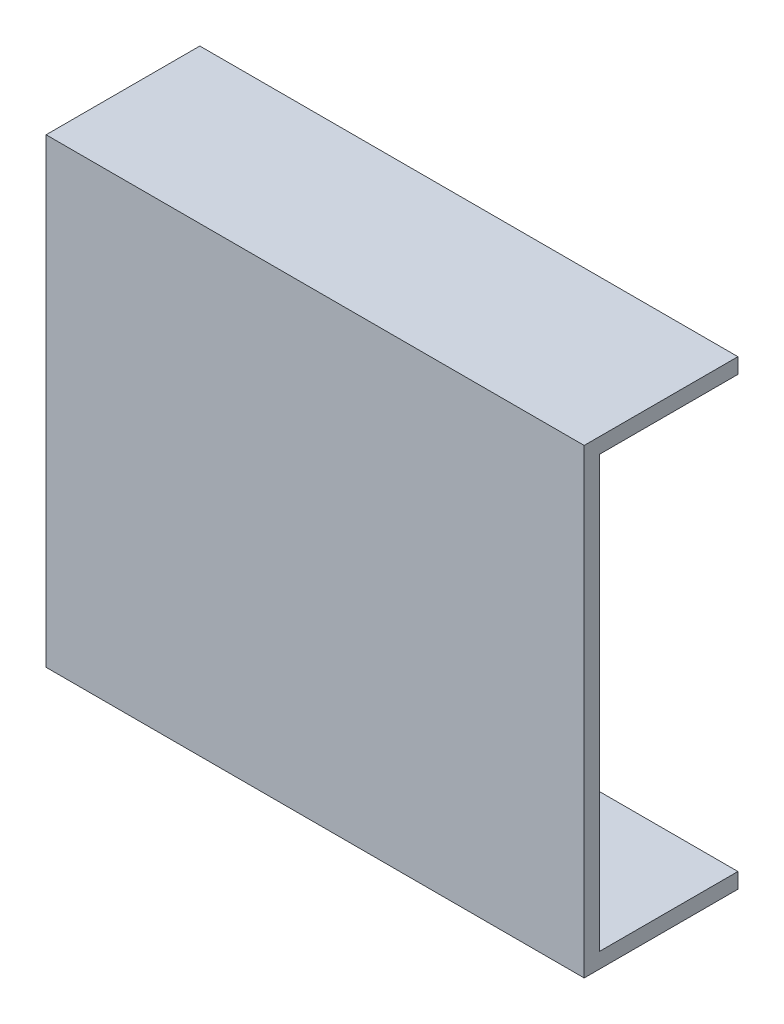
ISO-10303-21;
HEADER;
FILE_DESCRIPTION(('STEP AP214'),'2;1');
FILE_NAME('part.step','',(''),(''),'','','');
FILE_SCHEMA(('AUTOMOTIVE_DESIGN { 1 0 10303 214 1 1 1 1 }'));
ENDSEC;
DATA;
#1=APPLICATION_CONTEXT('core data for automotive mechanical design processes');
#2=APPLICATION_PROTOCOL_DEFINITION('international standard','automotive_design',2000,#1);
#3=PRODUCT_CONTEXT('',#1,'mechanical');
#4=PRODUCT('Part','Part','',(#3));
#5=PRODUCT_RELATED_PRODUCT_CATEGORY('part','',(#4));
#6=PRODUCT_DEFINITION_FORMATION('','',#4);
#7=PRODUCT_DEFINITION_CONTEXT('part definition',#1,'design');
#8=PRODUCT_DEFINITION('design','',#6,#7);
#9=PRODUCT_DEFINITION_SHAPE('','',#8);
#10=(LENGTH_UNIT() NAMED_UNIT(*) SI_UNIT(.MILLI.,.METRE.));
#11=(NAMED_UNIT(*) PLANE_ANGLE_UNIT() SI_UNIT($,.RADIAN.));
#12=(NAMED_UNIT(*) SI_UNIT($,.STERADIAN.) SOLID_ANGLE_UNIT());
#13=UNCERTAINTY_MEASURE_WITH_UNIT(LENGTH_MEASURE(1.E-05),#10,'distance_accuracy_value','');
#14=(GEOMETRIC_REPRESENTATION_CONTEXT(3) GLOBAL_UNCERTAINTY_ASSIGNED_CONTEXT((#13)) GLOBAL_UNIT_ASSIGNED_CONTEXT((#10,
#11,#12)) REPRESENTATION_CONTEXT('',''));
#15=CARTESIAN_POINT('',(0.,0.,0.));
#16=DIRECTION('',(0.,0.,1.));
#17=DIRECTION('',(1.,0.,0.));
#18=AXIS2_PLACEMENT_3D('',#15,#16,#17);
#19=CARTESIAN_POINT('',(0.,0.,10.));
#20=DIRECTION('',(0.,0.,1.));
#21=DIRECTION('',(1.,0.,0.));
#22=AXIS2_PLACEMENT_3D('',#19,#20,#21);
#23=PLANE('',#22);
#24=DIRECTION('',(-1.,0.,0.));
#25=VECTOR('',#24,1.);
#26=CARTESIAN_POINT('',(0.,-30.,10.));
#27=LINE('',#26,#25);
#28=CARTESIAN_POINT('',(35.,-30.,10.));
#29=VERTEX_POINT('',#28);
#30=CARTESIAN_POINT('',(-35.,-30.,10.));
#31=VERTEX_POINT('',#30);
#32=EDGE_CURVE('E11',#29,#31,#27,.T.);
#33=ORIENTED_EDGE('',*,*,#32,.F.);
#34=DIRECTION('',(0.,-1.,0.));
#35=VECTOR('',#34,1.);
#36=CARTESIAN_POINT('',(35.,0.,10.));
#37=LINE('',#36,#35);
#38=CARTESIAN_POINT('',(35.,30.,10.));
#39=VERTEX_POINT('',#38);
#40=EDGE_CURVE('E151',#39,#29,#37,.T.);
#41=ORIENTED_EDGE('',*,*,#40,.F.);
#42=DIRECTION('',(1.,0.,0.));
#43=VECTOR('',#42,1.);
#44=CARTESIAN_POINT('',(0.,30.,10.));
#45=LINE('',#44,#43);
#46=CARTESIAN_POINT('',(-35.,30.,10.));
#47=VERTEX_POINT('',#46);
#48=EDGE_CURVE('E160',#47,#39,#45,.T.);
#49=ORIENTED_EDGE('',*,*,#48,.F.);
#50=DIRECTION('',(0.,1.,0.));
#51=VECTOR('',#50,1.);
#52=CARTESIAN_POINT('',(-35.,0.,10.));
#53=LINE('',#52,#51);
#54=EDGE_CURVE('E27',#31,#47,#53,.T.);
#55=ORIENTED_EDGE('',*,*,#54,.F.);
#56=EDGE_LOOP('',(#33,#41,#49,#55));
#57=FACE_BOUND('',#56,.T.);
#58=ADVANCED_FACE('F17',(#57),#23,.T.);
#59=CARTESIAN_POINT('',(0.,-30.,8.));
#60=DIRECTION('',(0.,-1.,0.));
#61=DIRECTION('',(0.,0.,-1.));
#62=AXIS2_PLACEMENT_3D('',#59,#60,#61);
#63=PLANE('',#62);
#64=DIRECTION('',(0.,0.,1.));
#65=VECTOR('',#64,1.);
#66=CARTESIAN_POINT('',(35.,-30.,8.));
#67=LINE('',#66,#65);
#68=CARTESIAN_POINT('',(35.,-30.,-10.));
#69=VERTEX_POINT('',#68);
#70=EDGE_CURVE('E152',#69,#29,#67,.T.);
#71=ORIENTED_EDGE('',*,*,#70,.T.);
#72=ORIENTED_EDGE('',*,*,#32,.T.);
#73=DIRECTION('',(0.,0.,1.));
#74=VECTOR('',#73,1.);
#75=CARTESIAN_POINT('',(-35.,-30.,8.));
#76=LINE('',#75,#74);
#77=CARTESIAN_POINT('',(-35.,-30.,-10.));
#78=VERTEX_POINT('',#77);
#79=EDGE_CURVE('E150',#78,#31,#76,.T.);
#80=ORIENTED_EDGE('',*,*,#79,.F.);
#81=DIRECTION('',(1.,0.,0.));
#82=VECTOR('',#81,1.);
#83=CARTESIAN_POINT('',(0.,-30.,-10.));
#84=LINE('',#83,#82);
#85=EDGE_CURVE('E112',#78,#69,#84,.T.);
#86=ORIENTED_EDGE('',*,*,#85,.T.);
#87=EDGE_LOOP('',(#71,#72,#80,#86));
#88=FACE_BOUND('',#87,.T.);
#89=ADVANCED_FACE('F153',(#88),#63,.T.);
#90=CARTESIAN_POINT('',(-35.,0.,8.));
#91=DIRECTION('',(-1.,0.,0.));
#92=DIRECTION('',(0.,0.,1.));
#93=AXIS2_PLACEMENT_3D('',#90,#91,#92);
#94=PLANE('',#93);
#95=ORIENTED_EDGE('',*,*,#79,.T.);
#96=ORIENTED_EDGE('',*,*,#54,.T.);
#97=DIRECTION('',(0.,0.,1.));
#98=VECTOR('',#97,1.);
#99=CARTESIAN_POINT('',(-35.,30.,8.));
#100=LINE('',#99,#98);
#101=CARTESIAN_POINT('',(-35.,30.,-10.));
#102=VERTEX_POINT('',#101);
#103=EDGE_CURVE('E155',#102,#47,#100,.T.);
#104=ORIENTED_EDGE('',*,*,#103,.F.);
#105=DIRECTION('',(0.,-1.,0.));
#106=VECTOR('',#105,1.);
#107=CARTESIAN_POINT('',(-35.,29.,-10.));
#108=LINE('',#107,#106);
#109=CARTESIAN_POINT('',(-35.,28.,-10.));
#110=VERTEX_POINT('',#109);
#111=EDGE_CURVE('E97',#102,#110,#108,.T.);
#112=ORIENTED_EDGE('',*,*,#111,.T.);
#113=DIRECTION('',(0.,0.,1.));
#114=VECTOR('',#113,1.);
#115=CARTESIAN_POINT('',(-35.,28.,-10.));
#116=LINE('',#115,#114);
#117=CARTESIAN_POINT('',(-35.,28.,8.));
#118=VERTEX_POINT('',#117);
#119=EDGE_CURVE('E92',#110,#118,#116,.T.);
#120=ORIENTED_EDGE('',*,*,#119,.T.);
#121=DIRECTION('',(0.,-1.,0.));
#122=VECTOR('',#121,1.);
#123=CARTESIAN_POINT('',(-35.,0.,8.));
#124=LINE('',#123,#122);
#125=CARTESIAN_POINT('',(-35.,-28.,8.));
#126=VERTEX_POINT('',#125);
#127=EDGE_CURVE('E20',#118,#126,#124,.T.);
#128=ORIENTED_EDGE('',*,*,#127,.T.);
#129=DIRECTION('',(0.,0.,1.));
#130=VECTOR('',#129,1.);
#131=CARTESIAN_POINT('',(-35.,-28.,-10.));
#132=LINE('',#131,#130);
#133=CARTESIAN_POINT('',(-35.,-28.,-10.));
#134=VERTEX_POINT('',#133);
#135=EDGE_CURVE('E132',#134,#126,#132,.T.);
#136=ORIENTED_EDGE('',*,*,#135,.F.);
#137=DIRECTION('',(0.,-1.,0.));
#138=VECTOR('',#137,1.);
#139=CARTESIAN_POINT('',(-35.,-29.,-10.));
#140=LINE('',#139,#138);
#141=EDGE_CURVE('E117',#134,#78,#140,.T.);
#142=ORIENTED_EDGE('',*,*,#141,.T.);
#143=EDGE_LOOP('',(#95,#96,#104,#112,#120,#128,#136,#142));
#144=FACE_BOUND('',#143,.T.);
#145=ADVANCED_FACE('F144',(#144),#94,.T.);
#146=CARTESIAN_POINT('',(0.,30.,8.));
#147=DIRECTION('',(0.,1.,0.));
#148=DIRECTION('',(0.,0.,1.));
#149=AXIS2_PLACEMENT_3D('',#146,#147,#148);
#150=PLANE('',#149);
#151=ORIENTED_EDGE('',*,*,#103,.T.);
#152=ORIENTED_EDGE('',*,*,#48,.T.);
#153=DIRECTION('',(0.,0.,1.));
#154=VECTOR('',#153,1.);
#155=CARTESIAN_POINT('',(35.,30.,8.));
#156=LINE('',#155,#154);
#157=CARTESIAN_POINT('',(35.,30.,-10.));
#158=VERTEX_POINT('',#157);
#159=EDGE_CURVE('E157',#158,#39,#156,.T.);
#160=ORIENTED_EDGE('',*,*,#159,.F.);
#161=DIRECTION('',(-1.,0.,0.));
#162=VECTOR('',#161,1.);
#163=CARTESIAN_POINT('',(0.,30.,-10.));
#164=LINE('',#163,#162);
#165=EDGE_CURVE('E104',#158,#102,#164,.T.);
#166=ORIENTED_EDGE('',*,*,#165,.T.);
#167=EDGE_LOOP('',(#151,#152,#160,#166));
#168=FACE_BOUND('',#167,.T.);
#169=ADVANCED_FACE('F167',(#168),#150,.T.);
#170=CARTESIAN_POINT('',(0.,0.,8.));
#171=DIRECTION('',(0.,0.,-1.));
#172=DIRECTION('',(-1.,0.,0.));
#173=AXIS2_PLACEMENT_3D('',#170,#171,#172);
#174=PLANE('',#173);
#175=DIRECTION('',(-1.,0.,0.));
#176=VECTOR('',#175,1.);
#177=CARTESIAN_POINT('',(0.,28.,8.));
#178=LINE('',#177,#176);
#179=CARTESIAN_POINT('',(35.,28.,8.));
#180=VERTEX_POINT('',#179);
#181=EDGE_CURVE('E111',#180,#118,#178,.T.);
#182=ORIENTED_EDGE('',*,*,#181,.F.);
#183=DIRECTION('',(0.,1.,0.));
#184=VECTOR('',#183,1.);
#185=CARTESIAN_POINT('',(35.,0.,8.));
#186=LINE('',#185,#184);
#187=CARTESIAN_POINT('',(35.,-28.,8.));
#188=VERTEX_POINT('',#187);
#189=EDGE_CURVE('E88',#188,#180,#186,.T.);
#190=ORIENTED_EDGE('',*,*,#189,.F.);
#191=DIRECTION('',(1.,0.,0.));
#192=VECTOR('',#191,1.);
#193=CARTESIAN_POINT('',(0.,-28.,8.));
#194=LINE('',#193,#192);
#195=EDGE_CURVE('E129',#126,#188,#194,.T.);
#196=ORIENTED_EDGE('',*,*,#195,.F.);
#197=ORIENTED_EDGE('',*,*,#127,.F.);
#198=EDGE_LOOP('',(#182,#190,#196,#197));
#199=FACE_BOUND('',#198,.T.);
#200=ADVANCED_FACE('F171',(#199),#174,.T.);
#201=CARTESIAN_POINT('',(35.,0.,8.));
#202=DIRECTION('',(1.,0.,0.));
#203=DIRECTION('',(0.,0.,-1.));
#204=AXIS2_PLACEMENT_3D('',#201,#202,#203);
#205=PLANE('',#204);
#206=ORIENTED_EDGE('',*,*,#70,.F.);
#207=DIRECTION('',(0.,1.,0.));
#208=VECTOR('',#207,1.);
#209=CARTESIAN_POINT('',(35.,-29.,-10.));
#210=LINE('',#209,#208);
#211=CARTESIAN_POINT('',(35.,-28.,-10.));
#212=VERTEX_POINT('',#211);
#213=EDGE_CURVE('E120',#69,#212,#210,.T.);
#214=ORIENTED_EDGE('',*,*,#213,.T.);
#215=DIRECTION('',(0.,0.,1.));
#216=VECTOR('',#215,1.);
#217=CARTESIAN_POINT('',(35.,-28.,-10.));
#218=LINE('',#217,#216);
#219=EDGE_CURVE('E118',#212,#188,#218,.T.);
#220=ORIENTED_EDGE('',*,*,#219,.T.);
#221=ORIENTED_EDGE('',*,*,#189,.T.);
#222=DIRECTION('',(0.,0.,1.));
#223=VECTOR('',#222,1.);
#224=CARTESIAN_POINT('',(35.,28.,-10.));
#225=LINE('',#224,#223);
#226=CARTESIAN_POINT('',(35.,28.,-10.));
#227=VERTEX_POINT('',#226);
#228=EDGE_CURVE('E85',#227,#180,#225,.T.);
#229=ORIENTED_EDGE('',*,*,#228,.F.);
#230=DIRECTION('',(0.,1.,0.));
#231=VECTOR('',#230,1.);
#232=CARTESIAN_POINT('',(35.,29.,-10.));
#233=LINE('',#232,#231);
#234=EDGE_CURVE('E90',#227,#158,#233,.T.);
#235=ORIENTED_EDGE('',*,*,#234,.T.);
#236=ORIENTED_EDGE('',*,*,#159,.T.);
#237=ORIENTED_EDGE('',*,*,#40,.T.);
#238=EDGE_LOOP('',(#206,#214,#220,#221,#229,#235,#236,#237));
#239=FACE_BOUND('',#238,.T.);
#240=ADVANCED_FACE('F83',(#239),#205,.T.);
#241=CARTESIAN_POINT('',(0.,-28.,-10.));
#242=DIRECTION('',(0.,1.,0.));
#243=DIRECTION('',(0.,0.,1.));
#244=AXIS2_PLACEMENT_3D('',#241,#242,#243);
#245=PLANE('',#244);
#246=ORIENTED_EDGE('',*,*,#135,.T.);
#247=ORIENTED_EDGE('',*,*,#195,.T.);
#248=ORIENTED_EDGE('',*,*,#219,.F.);
#249=DIRECTION('',(-1.,0.,0.));
#250=VECTOR('',#249,1.);
#251=CARTESIAN_POINT('',(0.,-28.,-10.));
#252=LINE('',#251,#250);
#253=EDGE_CURVE('E121',#212,#134,#252,.T.);
#254=ORIENTED_EDGE('',*,*,#253,.T.);
#255=EDGE_LOOP('',(#246,#247,#248,#254));
#256=FACE_BOUND('',#255,.T.);
#257=ADVANCED_FACE('F141',(#256),#245,.T.);
#258=CARTESIAN_POINT('',(0.,-29.,-10.));
#259=DIRECTION('',(0.,0.,-1.));
#260=DIRECTION('',(-1.,0.,0.));
#261=AXIS2_PLACEMENT_3D('',#258,#259,#260);
#262=PLANE('',#261);
#263=ORIENTED_EDGE('',*,*,#213,.F.);
#264=ORIENTED_EDGE('',*,*,#85,.F.);
#265=ORIENTED_EDGE('',*,*,#141,.F.);
#266=ORIENTED_EDGE('',*,*,#253,.F.);
#267=EDGE_LOOP('',(#263,#264,#265,#266));
#268=FACE_BOUND('',#267,.T.);
#269=ADVANCED_FACE('F149',(#268),#262,.T.);
#270=CARTESIAN_POINT('',(0.,28.,-10.));
#271=DIRECTION('',(0.,-1.,0.));
#272=DIRECTION('',(0.,0.,-1.));
#273=AXIS2_PLACEMENT_3D('',#270,#271,#272);
#274=PLANE('',#273);
#275=ORIENTED_EDGE('',*,*,#228,.T.);
#276=ORIENTED_EDGE('',*,*,#181,.T.);
#277=ORIENTED_EDGE('',*,*,#119,.F.);
#278=DIRECTION('',(1.,0.,0.));
#279=VECTOR('',#278,1.);
#280=CARTESIAN_POINT('',(0.,28.,-10.));
#281=LINE('',#280,#279);
#282=EDGE_CURVE('E94',#110,#227,#281,.T.);
#283=ORIENTED_EDGE('',*,*,#282,.T.);
#284=EDGE_LOOP('',(#275,#276,#277,#283));
#285=FACE_BOUND('',#284,.T.);
#286=ADVANCED_FACE('F98',(#285),#274,.T.);
#287=CARTESIAN_POINT('',(0.,29.,-10.));
#288=DIRECTION('',(0.,0.,-1.));
#289=DIRECTION('',(-1.,0.,0.));
#290=AXIS2_PLACEMENT_3D('',#287,#288,#289);
#291=PLANE('',#290);
#292=ORIENTED_EDGE('',*,*,#234,.F.);
#293=ORIENTED_EDGE('',*,*,#282,.F.);
#294=ORIENTED_EDGE('',*,*,#111,.F.);
#295=ORIENTED_EDGE('',*,*,#165,.F.);
#296=EDGE_LOOP('',(#292,#293,#294,#295));
#297=FACE_BOUND('',#296,.T.);
#298=ADVANCED_FACE('F103',(#297),#291,.T.);
#299=CLOSED_SHELL('',(#58,#89,#145,#169,#200,#240,#257,#269,#286,#298));
#300=MANIFOLD_SOLID_BREP('B1',#299);
#301=ADVANCED_BREP_SHAPE_REPRESENTATION('',(#18,#300),#14);
#302=SHAPE_DEFINITION_REPRESENTATION(#9,#301);
ENDSEC;
END-ISO-10303-21;
